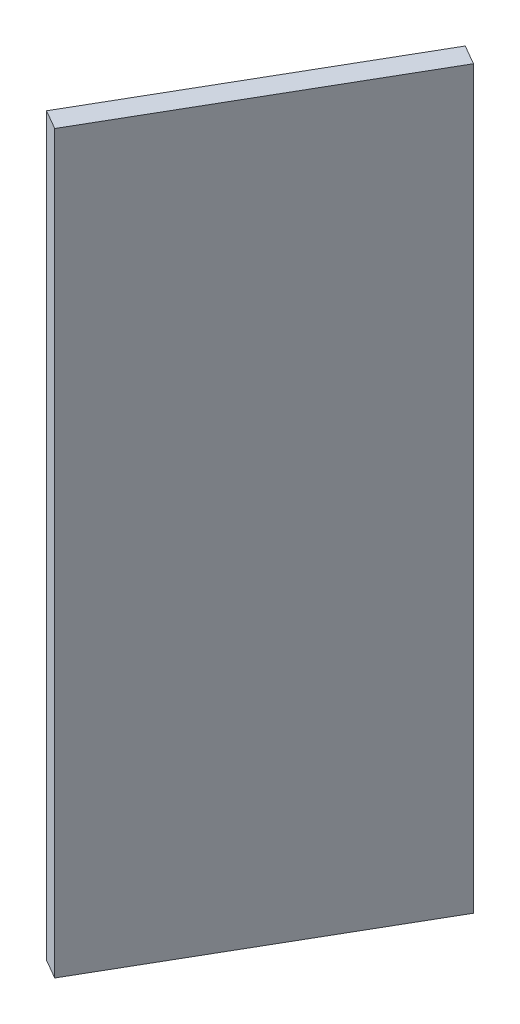
ISO-10303-21;
HEADER;
FILE_DESCRIPTION(('STEP AP214'),'2;1');
FILE_NAME('part.step','',(''),(''),'','','');
FILE_SCHEMA(('AUTOMOTIVE_DESIGN { 1 0 10303 214 1 1 1 1 }'));
ENDSEC;
DATA;
#1=APPLICATION_CONTEXT('core data for automotive mechanical design processes');
#2=APPLICATION_PROTOCOL_DEFINITION('international standard','automotive_design',2000,#1);
#3=PRODUCT_CONTEXT('',#1,'mechanical');
#4=PRODUCT('Part','Part','',(#3));
#5=PRODUCT_RELATED_PRODUCT_CATEGORY('part','',(#4));
#6=PRODUCT_DEFINITION_FORMATION('','',#4);
#7=PRODUCT_DEFINITION_CONTEXT('part definition',#1,'design');
#8=PRODUCT_DEFINITION('design','',#6,#7);
#9=PRODUCT_DEFINITION_SHAPE('','',#8);
#10=(LENGTH_UNIT() NAMED_UNIT(*) SI_UNIT(.MILLI.,.METRE.));
#11=(NAMED_UNIT(*) PLANE_ANGLE_UNIT() SI_UNIT($,.RADIAN.));
#12=(NAMED_UNIT(*) SI_UNIT($,.STERADIAN.) SOLID_ANGLE_UNIT());
#13=UNCERTAINTY_MEASURE_WITH_UNIT(LENGTH_MEASURE(1.E-05),#10,'distance_accuracy_value','');
#14=(GEOMETRIC_REPRESENTATION_CONTEXT(3) GLOBAL_UNCERTAINTY_ASSIGNED_CONTEXT((#13)) GLOBAL_UNIT_ASSIGNED_CONTEXT((#10,
#11,#12)) REPRESENTATION_CONTEXT('',''));
#15=CARTESIAN_POINT('',(0.,0.,0.));
#16=DIRECTION('',(0.,0.,1.));
#17=DIRECTION('',(1.,0.,0.));
#18=AXIS2_PLACEMENT_3D('',#15,#16,#17);
#19=CARTESIAN_POINT('',(-25.0592017150974,-360.,135.403810567666));
#20=DIRECTION('',(0.,-1.,0.));
#21=DIRECTION('',(0.,0.,-1.));
#22=AXIS2_PLACEMENT_3D('',#19,#20,#21);
#23=PLANE('',#22);
#24=DIRECTION('',(-0.866025403784441,0.,-0.5));
#25=VECTOR('',#24,1.);
#26=CARTESIAN_POINT('',(-90.5329222734684,-360.,270.807621135332));
#27=LINE('',#26,#25);
#28=CARTESIAN_POINT('',(-90.5329222734684,-360.,270.807621135332));
#29=VERTEX_POINT('',#28);
#30=CARTESIAN_POINT('',(-109.585481156726,-360.,259.807621135332));
#31=VERTEX_POINT('',#30);
#32=EDGE_CURVE('E11',#29,#31,#27,.T.);
#33=ORIENTED_EDGE('',*,*,#32,.T.);
#34=DIRECTION('',(0.5,0.,-0.866025403784439));
#35=VECTOR('',#34,1.);
#36=CARTESIAN_POINT('',(-109.585481156726,-360.,259.807621135332));
#37=LINE('',#36,#35);
#38=CARTESIAN_POINT('',(40.4145188432737,-360.,0.));
#39=VERTEX_POINT('',#38);
#40=EDGE_CURVE('E27',#31,#39,#37,.T.);
#41=ORIENTED_EDGE('',*,*,#40,.T.);
#42=DIRECTION('',(0.866025403784439,0.,0.5));
#43=VECTOR('',#42,1.);
#44=CARTESIAN_POINT('',(40.4145188432738,-360.,0.));
#45=LINE('',#44,#43);
#46=CARTESIAN_POINT('',(59.4670777265314,-360.,11.));
#47=VERTEX_POINT('',#46);
#48=EDGE_CURVE('E76',#39,#47,#45,.T.);
#49=ORIENTED_EDGE('',*,*,#48,.T.);
#50=DIRECTION('',(-0.5,0.,0.866025403784439));
#51=VECTOR('',#50,1.);
#52=CARTESIAN_POINT('',(59.4670777265314,-360.,11.));
#53=LINE('',#52,#51);
#54=EDGE_CURVE('E73',#47,#29,#53,.T.);
#55=ORIENTED_EDGE('',*,*,#54,.T.);
#56=EDGE_LOOP('',(#33,#41,#49,#55));
#57=FACE_BOUND('',#56,.T.);
#58=ADVANCED_FACE('F16',(#57),#23,.T.);
#59=CARTESIAN_POINT('',(40.4145188432737,0.,0.));
#60=DIRECTION('',(-0.866025403784439,0.,-0.5));
#61=DIRECTION('',(-0.5,0.,0.866025403784439));
#62=AXIS2_PLACEMENT_3D('',#59,#60,#61);
#63=PLANE('',#62);
#64=DIRECTION('',(0.,-1.,0.));
#65=VECTOR('',#64,1.);
#66=CARTESIAN_POINT('',(-109.585481156726,0.,259.807621135332));
#67=LINE('',#66,#65);
#68=CARTESIAN_POINT('',(-109.585481156726,360.,259.807621135332));
#69=VERTEX_POINT('',#68);
#70=EDGE_CURVE('E89',#69,#31,#67,.T.);
#71=ORIENTED_EDGE('',*,*,#70,.F.);
#72=DIRECTION('',(-0.5,0.,0.866025403784439));
#73=VECTOR('',#72,1.);
#74=CARTESIAN_POINT('',(-109.585481156726,360.,259.807621135332));
#75=LINE('',#74,#73);
#76=CARTESIAN_POINT('',(40.4145188432737,360.,0.));
#77=VERTEX_POINT('',#76);
#78=EDGE_CURVE('E67',#77,#69,#75,.T.);
#79=ORIENTED_EDGE('',*,*,#78,.F.);
#80=DIRECTION('',(0.,1.,0.));
#81=VECTOR('',#80,1.);
#82=CARTESIAN_POINT('',(40.4145188432737,0.,0.));
#83=LINE('',#82,#81);
#84=EDGE_CURVE('E82',#39,#77,#83,.T.);
#85=ORIENTED_EDGE('',*,*,#84,.F.);
#86=ORIENTED_EDGE('',*,*,#40,.F.);
#87=EDGE_LOOP('',(#71,#79,#85,#86));
#88=FACE_BOUND('',#87,.T.);
#89=ADVANCED_FACE('F159',(#88),#63,.T.);
#90=CARTESIAN_POINT('',(59.4670777265314,0.,11.));
#91=DIRECTION('',(0.5,0.,-0.866025403784439));
#92=DIRECTION('',(0.,-1.,0.));
#93=AXIS2_PLACEMENT_3D('',#90,#91,#92);
#94=PLANE('',#93);
#95=ORIENTED_EDGE('',*,*,#84,.T.);
#96=DIRECTION('',(-0.866025403784439,0.,-0.5));
#97=VECTOR('',#96,1.);
#98=CARTESIAN_POINT('',(40.4145188432738,360.,0.));
#99=LINE('',#98,#97);
#100=CARTESIAN_POINT('',(59.4670777265314,360.,11.));
#101=VERTEX_POINT('',#100);
#102=EDGE_CURVE('E102',#101,#77,#99,.T.);
#103=ORIENTED_EDGE('',*,*,#102,.F.);
#104=DIRECTION('',(0.,1.,0.));
#105=VECTOR('',#104,1.);
#106=CARTESIAN_POINT('',(59.4670777265314,0.,11.));
#107=LINE('',#106,#105);
#108=EDGE_CURVE('E20',#47,#101,#107,.T.);
#109=ORIENTED_EDGE('',*,*,#108,.F.);
#110=ORIENTED_EDGE('',*,*,#48,.F.);
#111=EDGE_LOOP('',(#95,#103,#109,#110));
#112=FACE_BOUND('',#111,.T.);
#113=ADVANCED_FACE('F164',(#112),#94,.T.);
#114=CARTESIAN_POINT('',(-90.5329222734684,0.,270.807621135332));
#115=DIRECTION('',(0.866025403784439,0.,0.5));
#116=DIRECTION('',(0.,-1.,0.));
#117=AXIS2_PLACEMENT_3D('',#114,#115,#116);
#118=PLANE('',#117);
#119=ORIENTED_EDGE('',*,*,#108,.T.);
#120=DIRECTION('',(0.5,0.,-0.866025403784439));
#121=VECTOR('',#120,1.);
#122=CARTESIAN_POINT('',(59.4670777265314,360.,11.));
#123=LINE('',#122,#121);
#124=CARTESIAN_POINT('',(-90.5329222734684,360.,270.807621135332));
#125=VERTEX_POINT('',#124);
#126=EDGE_CURVE('E91',#125,#101,#123,.T.);
#127=ORIENTED_EDGE('',*,*,#126,.F.);
#128=DIRECTION('',(0.,1.,0.));
#129=VECTOR('',#128,1.);
#130=CARTESIAN_POINT('',(-90.5329222734684,0.,270.807621135332));
#131=LINE('',#130,#129);
#132=EDGE_CURVE('E88',#29,#125,#131,.T.);
#133=ORIENTED_EDGE('',*,*,#132,.F.);
#134=ORIENTED_EDGE('',*,*,#54,.F.);
#135=EDGE_LOOP('',(#119,#127,#133,#134));
#136=FACE_BOUND('',#135,.T.);
#137=ADVANCED_FACE('F18',(#136),#118,.T.);
#138=CARTESIAN_POINT('',(-109.585481156726,0.,259.807621135332));
#139=DIRECTION('',(-0.5,0.,0.866025403784441));
#140=DIRECTION('',(0.,1.,0.));
#141=AXIS2_PLACEMENT_3D('',#138,#139,#140);
#142=PLANE('',#141);
#143=ORIENTED_EDGE('',*,*,#132,.T.);
#144=DIRECTION('',(0.866025403784441,0.,0.5));
#145=VECTOR('',#144,1.);
#146=CARTESIAN_POINT('',(-90.5329222734684,360.,270.807621135332));
#147=LINE('',#146,#145);
#148=EDGE_CURVE('E99',#69,#125,#147,.T.);
#149=ORIENTED_EDGE('',*,*,#148,.F.);
#150=ORIENTED_EDGE('',*,*,#70,.T.);
#151=ORIENTED_EDGE('',*,*,#32,.F.);
#152=EDGE_LOOP('',(#143,#149,#150,#151));
#153=FACE_BOUND('',#152,.T.);
#154=ADVANCED_FACE('F86',(#153),#142,.T.);
#155=CARTESIAN_POINT('',(-25.0592017150974,360.,135.403810567666));
#156=DIRECTION('',(0.,1.,0.));
#157=DIRECTION('',(1.,0.,0.));
#158=AXIS2_PLACEMENT_3D('',#155,#156,#157);
#159=PLANE('',#158);
#160=ORIENTED_EDGE('',*,*,#148,.T.);
#161=ORIENTED_EDGE('',*,*,#126,.T.);
#162=ORIENTED_EDGE('',*,*,#102,.T.);
#163=ORIENTED_EDGE('',*,*,#78,.T.);
#164=EDGE_LOOP('',(#160,#161,#162,#163));
#165=FACE_BOUND('',#164,.T.);
#166=ADVANCED_FACE('F147',(#165),#159,.T.);
#167=CLOSED_SHELL('',(#58,#89,#113,#137,#154,#166));
#168=MANIFOLD_SOLID_BREP('B1',#167);
#169=ADVANCED_BREP_SHAPE_REPRESENTATION('',(#18,#168),#14);
#170=SHAPE_DEFINITION_REPRESENTATION(#9,#169);
ENDSEC;
END-ISO-10303-21;
